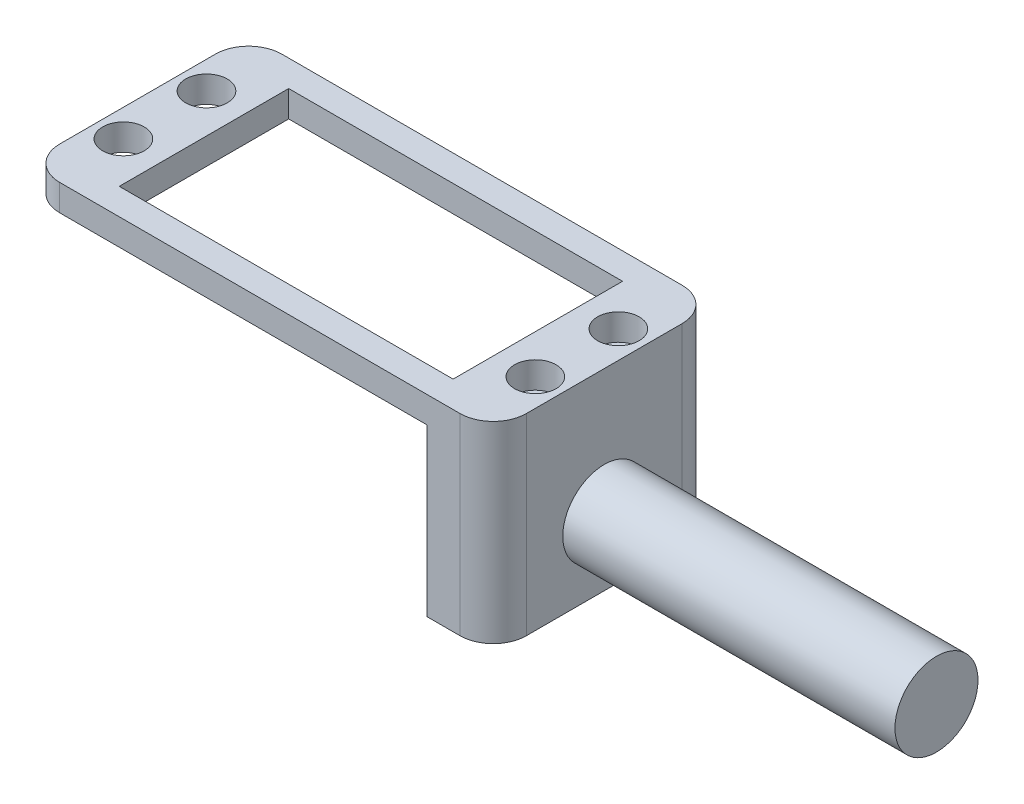
ISO-10303-21;
HEADER;
FILE_DESCRIPTION(('STEP AP214'),'2;1');
FILE_NAME('part.step','',(''),(''),'','','');
FILE_SCHEMA(('AUTOMOTIVE_DESIGN { 1 0 10303 214 1 1 1 1 }'));
ENDSEC;
DATA;
#1=APPLICATION_CONTEXT('core data for automotive mechanical design processes');
#2=APPLICATION_PROTOCOL_DEFINITION('international standard','automotive_design',2000,#1);
#3=PRODUCT_CONTEXT('',#1,'mechanical');
#4=PRODUCT('Part','Part','',(#3));
#5=PRODUCT_RELATED_PRODUCT_CATEGORY('part','',(#4));
#6=PRODUCT_DEFINITION_FORMATION('','',#4);
#7=PRODUCT_DEFINITION_CONTEXT('part definition',#1,'design');
#8=PRODUCT_DEFINITION('design','',#6,#7);
#9=PRODUCT_DEFINITION_SHAPE('','',#8);
#10=(LENGTH_UNIT() NAMED_UNIT(*) SI_UNIT(.MILLI.,.METRE.));
#11=(NAMED_UNIT(*) PLANE_ANGLE_UNIT() SI_UNIT($,.RADIAN.));
#12=(NAMED_UNIT(*) SI_UNIT($,.STERADIAN.) SOLID_ANGLE_UNIT());
#13=UNCERTAINTY_MEASURE_WITH_UNIT(LENGTH_MEASURE(1.E-05),#10,'distance_accuracy_value','');
#14=(GEOMETRIC_REPRESENTATION_CONTEXT(3) GLOBAL_UNCERTAINTY_ASSIGNED_CONTEXT((#13)) GLOBAL_UNIT_ASSIGNED_CONTEXT((#10,
#11,#12)) REPRESENTATION_CONTEXT('',''));
#15=CARTESIAN_POINT('',(0.,0.,0.));
#16=DIRECTION('',(0.,0.,1.));
#17=DIRECTION('',(1.,0.,0.));
#18=AXIS2_PLACEMENT_3D('',#15,#16,#17);
#19=CARTESIAN_POINT('',(0.,0.,0.));
#20=DIRECTION('',(0.,1.,0.));
#21=DIRECTION('',(0.,0.,1.));
#22=AXIS2_PLACEMENT_3D('',#19,#20,#21);
#23=PLANE('',#22);
#24=CARTESIAN_POINT('',(-24.8,0.,-4.99999999999998));
#25=DIRECTION('',(0.,1.,0.));
#26=DIRECTION('',(0.,0.,-1.));
#27=AXIS2_PLACEMENT_3D('',#24,#25,#26);
#28=CIRCLE('',#27,2.5);
#29=CARTESIAN_POINT('',(-24.8,0.,-7.49999999999998));
#30=VERTEX_POINT('',#29);
#31=EDGE_CURVE('E156',#30,#30,#28,.T.);
#32=ORIENTED_EDGE('',*,*,#31,.T.);
#33=EDGE_LOOP('',(#32));
#34=FACE_BOUND('',#33,.T.);
#35=CARTESIAN_POINT('',(-24.8,0.,5.00000000000002));
#36=DIRECTION('',(0.,1.,0.));
#37=DIRECTION('',(0.,0.,-1.));
#38=AXIS2_PLACEMENT_3D('',#35,#36,#37);
#39=CIRCLE('',#38,2.5);
#40=CARTESIAN_POINT('',(-24.8,0.,2.50000000000002));
#41=VERTEX_POINT('',#40);
#42=EDGE_CURVE('E177',#41,#41,#39,.T.);
#43=ORIENTED_EDGE('',*,*,#42,.T.);
#44=EDGE_LOOP('',(#43));
#45=FACE_BOUND('',#44,.T.);
#46=DIRECTION('',(1.,0.,0.));
#47=VECTOR('',#46,1.);
#48=CARTESIAN_POINT('',(-28.1,0.,13.375));
#49=LINE('',#48,#47);
#50=CARTESIAN_POINT('',(-24.1,0.,13.375));
#51=VERTEX_POINT('',#50);
#52=CARTESIAN_POINT('',(20.1,0.,13.375));
#53=VERTEX_POINT('',#52);
#54=EDGE_CURVE('E152',#51,#53,#49,.T.);
#55=ORIENTED_EDGE('',*,*,#54,.F.);
#56=CARTESIAN_POINT('',(-24.1,0.,9.375));
#57=DIRECTION('',(0.,1.,0.));
#58=DIRECTION('',(0.,0.,1.));
#59=AXIS2_PLACEMENT_3D('',#56,#57,#58);
#60=CIRCLE('',#59,4.);
#61=CARTESIAN_POINT('',(-28.1,0.,9.37500000000001));
#62=VERTEX_POINT('',#61);
#63=EDGE_CURVE('E48',#51,#62,#60,.F.);
#64=ORIENTED_EDGE('',*,*,#63,.T.);
#65=DIRECTION('',(0.,0.,1.));
#66=VECTOR('',#65,1.);
#67=CARTESIAN_POINT('',(-28.1,0.,-13.375));
#68=LINE('',#67,#66);
#69=CARTESIAN_POINT('',(-28.1,0.,-9.37499999999999));
#70=VERTEX_POINT('',#69);
#71=EDGE_CURVE('E238',#70,#62,#68,.T.);
#72=ORIENTED_EDGE('',*,*,#71,.F.);
#73=CARTESIAN_POINT('',(-24.1,0.,-9.37499999999999));
#74=DIRECTION('',(0.,1.,0.));
#75=DIRECTION('',(0.,0.,1.));
#76=AXIS2_PLACEMENT_3D('',#73,#74,#75);
#77=CIRCLE('',#76,4.);
#78=CARTESIAN_POINT('',(-24.1,0.,-13.375));
#79=VERTEX_POINT('',#78);
#80=EDGE_CURVE('E56',#70,#79,#77,.F.);
#81=ORIENTED_EDGE('',*,*,#80,.T.);
#82=DIRECTION('',(-1.,0.,0.));
#83=VECTOR('',#82,1.);
#84=CARTESIAN_POINT('',(-28.1,0.,-13.375));
#85=LINE('',#84,#83);
#86=CARTESIAN_POINT('',(20.1,0.,-13.375));
#87=VERTEX_POINT('',#86);
#88=EDGE_CURVE('E223',#87,#79,#85,.T.);
#89=ORIENTED_EDGE('',*,*,#88,.F.);
#90=DIRECTION('',(0.,0.,-1.));
#91=VECTOR('',#90,1.);
#92=CARTESIAN_POINT('',(20.1,0.,-13.375));
#93=LINE('',#92,#91);
#94=CARTESIAN_POINT('',(20.1,0.,-10.2));
#95=VERTEX_POINT('',#94);
#96=EDGE_CURVE('E172',#95,#87,#93,.T.);
#97=ORIENTED_EDGE('',*,*,#96,.F.);
#98=DIRECTION('',(-1.,0.,0.));
#99=VECTOR('',#98,1.);
#100=CARTESIAN_POINT('',(-20.1,0.,-10.2));
#101=LINE('',#100,#99);
#102=CARTESIAN_POINT('',(-20.1,0.,-10.2));
#103=VERTEX_POINT('',#102);
#104=EDGE_CURVE('E195',#95,#103,#101,.T.);
#105=ORIENTED_EDGE('',*,*,#104,.T.);
#106=DIRECTION('',(0.,0.,1.));
#107=VECTOR('',#106,1.);
#108=CARTESIAN_POINT('',(-20.1,0.,-10.2));
#109=LINE('',#108,#107);
#110=CARTESIAN_POINT('',(-20.1,0.,10.2));
#111=VERTEX_POINT('',#110);
#112=EDGE_CURVE('E211',#103,#111,#109,.T.);
#113=ORIENTED_EDGE('',*,*,#112,.T.);
#114=DIRECTION('',(1.,0.,0.));
#115=VECTOR('',#114,1.);
#116=CARTESIAN_POINT('',(-20.1,0.,10.2));
#117=LINE('',#116,#115);
#118=CARTESIAN_POINT('',(20.1,0.,10.2));
#119=VERTEX_POINT('',#118);
#120=EDGE_CURVE('E201',#111,#119,#117,.T.);
#121=ORIENTED_EDGE('',*,*,#120,.T.);
#122=EDGE_CURVE('E169',#53,#119,#93,.T.);
#123=ORIENTED_EDGE('',*,*,#122,.F.);
#124=EDGE_LOOP('',(#55,#64,#72,#81,#89,#97,#105,#113,#121,#123));
#125=FACE_BOUND('',#124,.T.);
#126=ADVANCED_FACE('F33',(#34,#45,#125),#23,.F.);
#127=CARTESIAN_POINT('',(0.,3.175,0.));
#128=DIRECTION('',(0.,1.,0.));
#129=DIRECTION('',(0.,0.,1.));
#130=AXIS2_PLACEMENT_3D('',#127,#128,#129);
#131=PLANE('',#130);
#132=CARTESIAN_POINT('',(-24.8,3.175,5.00000000000002));
#133=DIRECTION('',(0.,1.,0.));
#134=DIRECTION('',(0.,0.,-1.));
#135=AXIS2_PLACEMENT_3D('',#132,#133,#134);
#136=CIRCLE('',#135,2.5);
#137=CARTESIAN_POINT('',(-24.8,3.175,2.50000000000002));
#138=VERTEX_POINT('',#137);
#139=EDGE_CURVE('E180',#138,#138,#136,.T.);
#140=ORIENTED_EDGE('',*,*,#139,.F.);
#141=EDGE_LOOP('',(#140));
#142=FACE_BOUND('',#141,.T.);
#143=CARTESIAN_POINT('',(24.8,3.175,-4.99999999999999));
#144=DIRECTION('',(0.,1.,0.));
#145=DIRECTION('',(0.,0.,1.));
#146=AXIS2_PLACEMENT_3D('',#143,#144,#145);
#147=CIRCLE('',#146,2.5);
#148=CARTESIAN_POINT('',(24.8,3.175,-2.5));
#149=VERTEX_POINT('',#148);
#150=EDGE_CURVE('E192',#149,#149,#147,.T.);
#151=ORIENTED_EDGE('',*,*,#150,.F.);
#152=EDGE_LOOP('',(#151));
#153=FACE_BOUND('',#152,.T.);
#154=DIRECTION('',(0.,0.,-1.));
#155=VECTOR('',#154,1.);
#156=CARTESIAN_POINT('',(28.1,3.175,-13.375));
#157=LINE('',#156,#155);
#158=CARTESIAN_POINT('',(28.1,3.175,9.37499999999999));
#159=VERTEX_POINT('',#158);
#160=CARTESIAN_POINT('',(28.1,3.175,-9.375));
#161=VERTEX_POINT('',#160);
#162=EDGE_CURVE('E224',#159,#161,#157,.T.);
#163=ORIENTED_EDGE('',*,*,#162,.T.);
#164=CARTESIAN_POINT('',(24.1,3.175,-9.375));
#165=DIRECTION('',(0.,1.,0.));
#166=DIRECTION('',(0.,0.,1.));
#167=AXIS2_PLACEMENT_3D('',#164,#165,#166);
#168=CIRCLE('',#167,4.);
#169=CARTESIAN_POINT('',(24.1,3.175,-13.375));
#170=VERTEX_POINT('',#169);
#171=EDGE_CURVE('E260',#161,#170,#168,.T.);
#172=ORIENTED_EDGE('',*,*,#171,.T.);
#173=DIRECTION('',(-1.,0.,0.));
#174=VECTOR('',#173,1.);
#175=CARTESIAN_POINT('',(-28.1,3.175,-13.375));
#176=LINE('',#175,#174);
#177=CARTESIAN_POINT('',(-24.1,3.175,-13.375));
#178=VERTEX_POINT('',#177);
#179=EDGE_CURVE('E227',#170,#178,#176,.T.);
#180=ORIENTED_EDGE('',*,*,#179,.T.);
#181=CARTESIAN_POINT('',(-24.1,3.175,-9.37499999999999));
#182=DIRECTION('',(0.,1.,0.));
#183=DIRECTION('',(0.,0.,1.));
#184=AXIS2_PLACEMENT_3D('',#181,#182,#183);
#185=CIRCLE('',#184,4.);
#186=CARTESIAN_POINT('',(-28.1,3.175,-9.37499999999999));
#187=VERTEX_POINT('',#186);
#188=EDGE_CURVE('E254',#178,#187,#185,.T.);
#189=ORIENTED_EDGE('',*,*,#188,.T.);
#190=DIRECTION('',(0.,0.,1.));
#191=VECTOR('',#190,1.);
#192=CARTESIAN_POINT('',(-28.1,3.175,-13.375));
#193=LINE('',#192,#191);
#194=CARTESIAN_POINT('',(-28.1,3.175,9.37500000000001));
#195=VERTEX_POINT('',#194);
#196=EDGE_CURVE('E230',#187,#195,#193,.T.);
#197=ORIENTED_EDGE('',*,*,#196,.T.);
#198=CARTESIAN_POINT('',(-24.1,3.175,9.375));
#199=DIRECTION('',(0.,1.,0.));
#200=DIRECTION('',(0.,0.,1.));
#201=AXIS2_PLACEMENT_3D('',#198,#199,#200);
#202=CIRCLE('',#201,4.);
#203=CARTESIAN_POINT('',(-24.1,3.175,13.375));
#204=VERTEX_POINT('',#203);
#205=EDGE_CURVE('E256',#195,#204,#202,.T.);
#206=ORIENTED_EDGE('',*,*,#205,.T.);
#207=DIRECTION('',(1.,0.,0.));
#208=VECTOR('',#207,1.);
#209=CARTESIAN_POINT('',(-28.1,3.175,13.375));
#210=LINE('',#209,#208);
#211=CARTESIAN_POINT('',(24.1,3.175,13.375));
#212=VERTEX_POINT('',#211);
#213=EDGE_CURVE('E233',#204,#212,#210,.T.);
#214=ORIENTED_EDGE('',*,*,#213,.T.);
#215=CARTESIAN_POINT('',(24.1,3.175,9.37499999999999));
#216=DIRECTION('',(0.,1.,0.));
#217=DIRECTION('',(0.,0.,1.));
#218=AXIS2_PLACEMENT_3D('',#215,#216,#217);
#219=CIRCLE('',#218,4.);
#220=EDGE_CURVE('E258',#212,#159,#219,.T.);
#221=ORIENTED_EDGE('',*,*,#220,.T.);
#222=EDGE_LOOP('',(#163,#172,#180,#189,#197,#206,#214,#221));
#223=FACE_BOUND('',#222,.T.);
#224=DIRECTION('',(-1.,0.,0.));
#225=VECTOR('',#224,1.);
#226=CARTESIAN_POINT('',(-20.1,3.175,-10.2));
#227=LINE('',#226,#225);
#228=CARTESIAN_POINT('',(20.1,3.175,-10.2));
#229=VERTEX_POINT('',#228);
#230=CARTESIAN_POINT('',(-20.1,3.175,-10.2));
#231=VERTEX_POINT('',#230);
#232=EDGE_CURVE('E200',#229,#231,#227,.T.);
#233=ORIENTED_EDGE('',*,*,#232,.F.);
#234=DIRECTION('',(0.,0.,-1.));
#235=VECTOR('',#234,1.);
#236=CARTESIAN_POINT('',(20.1,3.175,-10.2));
#237=LINE('',#236,#235);
#238=CARTESIAN_POINT('',(20.1,3.175,10.2));
#239=VERTEX_POINT('',#238);
#240=EDGE_CURVE('E198',#239,#229,#237,.T.);
#241=ORIENTED_EDGE('',*,*,#240,.F.);
#242=DIRECTION('',(1.,0.,0.));
#243=VECTOR('',#242,1.);
#244=CARTESIAN_POINT('',(-20.1,3.175,10.2));
#245=LINE('',#244,#243);
#246=CARTESIAN_POINT('',(-20.1,3.175,10.2));
#247=VERTEX_POINT('',#246);
#248=EDGE_CURVE('E206',#247,#239,#245,.T.);
#249=ORIENTED_EDGE('',*,*,#248,.F.);
#250=DIRECTION('',(0.,0.,1.));
#251=VECTOR('',#250,1.);
#252=CARTESIAN_POINT('',(-20.1,3.175,-10.2));
#253=LINE('',#252,#251);
#254=EDGE_CURVE('E203',#231,#247,#253,.T.);
#255=ORIENTED_EDGE('',*,*,#254,.F.);
#256=EDGE_LOOP('',(#233,#241,#249,#255));
#257=FACE_BOUND('',#256,.T.);
#258=CARTESIAN_POINT('',(24.8,3.175,5.00000000000001));
#259=DIRECTION('',(0.,1.,0.));
#260=DIRECTION('',(0.,0.,1.));
#261=AXIS2_PLACEMENT_3D('',#258,#259,#260);
#262=CIRCLE('',#261,2.5);
#263=CARTESIAN_POINT('',(24.8,3.175,7.50000000000001));
#264=VERTEX_POINT('',#263);
#265=EDGE_CURVE('E186',#264,#264,#262,.T.);
#266=ORIENTED_EDGE('',*,*,#265,.F.);
#267=EDGE_LOOP('',(#266));
#268=FACE_BOUND('',#267,.T.);
#269=CARTESIAN_POINT('',(-24.8,3.175,-4.99999999999998));
#270=DIRECTION('',(0.,1.,0.));
#271=DIRECTION('',(0.,0.,-1.));
#272=AXIS2_PLACEMENT_3D('',#269,#270,#271);
#273=CIRCLE('',#272,2.5);
#274=CARTESIAN_POINT('',(-24.8,3.175,-7.49999999999998));
#275=VERTEX_POINT('',#274);
#276=EDGE_CURVE('E174',#275,#275,#273,.T.);
#277=ORIENTED_EDGE('',*,*,#276,.F.);
#278=EDGE_LOOP('',(#277));
#279=FACE_BOUND('',#278,.T.);
#280=ADVANCED_FACE('F276',(#142,#153,#223,#257,#268,#279),#131,.T.);
#281=CARTESIAN_POINT('',(28.1,3.175,-13.375));
#282=DIRECTION('',(-1.,0.,0.));
#283=DIRECTION('',(0.,0.,1.));
#284=AXIS2_PLACEMENT_3D('',#281,#282,#283);
#285=PLANE('',#284);
#286=CARTESIAN_POINT('',(28.1,-11.825,0.));
#287=DIRECTION('',(-1.,0.,0.));
#288=DIRECTION('',(0.,0.,1.));
#289=AXIS2_PLACEMENT_3D('',#286,#287,#288);
#290=CIRCLE('',#289,5.);
#291=CARTESIAN_POINT('',(28.1,-11.825,5.));
#292=VERTEX_POINT('',#291);
#293=EDGE_CURVE('E11',#292,#292,#290,.F.);
#294=ORIENTED_EDGE('',*,*,#293,.F.);
#295=EDGE_LOOP('',(#294));
#296=FACE_BOUND('',#295,.T.);
#297=DIRECTION('',(0.,0.,1.));
#298=VECTOR('',#297,1.);
#299=CARTESIAN_POINT('',(28.1,-20.,-13.375));
#300=LINE('',#299,#298);
#301=CARTESIAN_POINT('',(28.1,-20.,-9.375));
#302=VERTEX_POINT('',#301);
#303=CARTESIAN_POINT('',(28.1,-20.,9.37499999999999));
#304=VERTEX_POINT('',#303);
#305=EDGE_CURVE('E146',#302,#304,#300,.T.);
#306=ORIENTED_EDGE('',*,*,#305,.F.);
#307=DIRECTION('',(0.,-1.,0.));
#308=VECTOR('',#307,1.);
#309=CARTESIAN_POINT('',(28.1,3.175,-9.375));
#310=LINE('',#309,#308);
#311=EDGE_CURVE('E252',#302,#161,#310,.F.);
#312=ORIENTED_EDGE('',*,*,#311,.T.);
#313=ORIENTED_EDGE('',*,*,#162,.F.);
#314=DIRECTION('',(0.,-1.,0.));
#315=VECTOR('',#314,1.);
#316=CARTESIAN_POINT('',(28.1,3.175,9.37499999999999));
#317=LINE('',#316,#315);
#318=EDGE_CURVE('E249',#159,#304,#317,.T.);
#319=ORIENTED_EDGE('',*,*,#318,.T.);
#320=EDGE_LOOP('',(#306,#312,#313,#319));
#321=FACE_BOUND('',#320,.T.);
#322=ADVANCED_FACE('F306',(#296,#321),#285,.F.);
#323=CARTESIAN_POINT('',(-28.1,3.175,-13.375));
#324=DIRECTION('',(0.,0.,1.));
#325=DIRECTION('',(1.,0.,0.));
#326=AXIS2_PLACEMENT_3D('',#323,#324,#325);
#327=PLANE('',#326);
#328=ORIENTED_EDGE('',*,*,#179,.F.);
#329=DIRECTION('',(0.,-1.,0.));
#330=VECTOR('',#329,1.);
#331=CARTESIAN_POINT('',(24.1,3.175,-13.375));
#332=LINE('',#331,#330);
#333=CARTESIAN_POINT('',(24.1,-20.,-13.375));
#334=VERTEX_POINT('',#333);
#335=EDGE_CURVE('E243',#170,#334,#332,.T.);
#336=ORIENTED_EDGE('',*,*,#335,.T.);
#337=DIRECTION('',(1.,0.,0.));
#338=VECTOR('',#337,1.);
#339=CARTESIAN_POINT('',(28.1,-20.,-13.375));
#340=LINE('',#339,#338);
#341=CARTESIAN_POINT('',(20.1,-20.,-13.375));
#342=VERTEX_POINT('',#341);
#343=EDGE_CURVE('E164',#342,#334,#340,.T.);
#344=ORIENTED_EDGE('',*,*,#343,.F.);
#345=DIRECTION('',(0.,1.,0.));
#346=VECTOR('',#345,1.);
#347=CARTESIAN_POINT('',(20.1,-20.,-13.375));
#348=LINE('',#347,#346);
#349=EDGE_CURVE('E157',#342,#87,#348,.T.);
#350=ORIENTED_EDGE('',*,*,#349,.T.);
#351=ORIENTED_EDGE('',*,*,#88,.T.);
#352=DIRECTION('',(0.,-1.,0.));
#353=VECTOR('',#352,1.);
#354=CARTESIAN_POINT('',(-24.1,3.175,-13.375));
#355=LINE('',#354,#353);
#356=EDGE_CURVE('E241',#79,#178,#355,.F.);
#357=ORIENTED_EDGE('',*,*,#356,.T.);
#358=EDGE_LOOP('',(#328,#336,#344,#350,#351,#357));
#359=FACE_BOUND('',#358,.T.);
#360=ADVANCED_FACE('F300',(#359),#327,.F.);
#361=CARTESIAN_POINT('',(-28.1,3.175,-13.375));
#362=DIRECTION('',(1.,0.,0.));
#363=DIRECTION('',(0.,0.,-1.));
#364=AXIS2_PLACEMENT_3D('',#361,#362,#363);
#365=PLANE('',#364);
#366=ORIENTED_EDGE('',*,*,#71,.T.);
#367=DIRECTION('',(0.,-1.,0.));
#368=VECTOR('',#367,1.);
#369=CARTESIAN_POINT('',(-28.1,3.175,9.37500000000001));
#370=LINE('',#369,#368);
#371=EDGE_CURVE('E41',#62,#195,#370,.F.);
#372=ORIENTED_EDGE('',*,*,#371,.T.);
#373=ORIENTED_EDGE('',*,*,#196,.F.);
#374=DIRECTION('',(0.,-1.,0.));
#375=VECTOR('',#374,1.);
#376=CARTESIAN_POINT('',(-28.1,3.175,-9.37499999999999));
#377=LINE('',#376,#375);
#378=EDGE_CURVE('E268',#187,#70,#377,.T.);
#379=ORIENTED_EDGE('',*,*,#378,.T.);
#380=EDGE_LOOP('',(#366,#372,#373,#379));
#381=FACE_BOUND('',#380,.T.);
#382=ADVANCED_FACE('F272',(#381),#365,.F.);
#383=CARTESIAN_POINT('',(-28.1,3.175,13.375));
#384=DIRECTION('',(0.,0.,-1.));
#385=DIRECTION('',(-1.,0.,0.));
#386=AXIS2_PLACEMENT_3D('',#383,#384,#385);
#387=PLANE('',#386);
#388=DIRECTION('',(-1.,0.,0.));
#389=VECTOR('',#388,1.);
#390=CARTESIAN_POINT('',(28.1,-20.,13.375));
#391=LINE('',#390,#389);
#392=CARTESIAN_POINT('',(24.1,-20.,13.375));
#393=VERTEX_POINT('',#392);
#394=CARTESIAN_POINT('',(20.1,-20.,13.375));
#395=VERTEX_POINT('',#394);
#396=EDGE_CURVE('E135',#393,#395,#391,.T.);
#397=ORIENTED_EDGE('',*,*,#396,.F.);
#398=DIRECTION('',(0.,-1.,0.));
#399=VECTOR('',#398,1.);
#400=CARTESIAN_POINT('',(24.1,3.175,13.375));
#401=LINE('',#400,#399);
#402=EDGE_CURVE('E264',#393,#212,#401,.F.);
#403=ORIENTED_EDGE('',*,*,#402,.T.);
#404=ORIENTED_EDGE('',*,*,#213,.F.);
#405=DIRECTION('',(0.,-1.,0.));
#406=VECTOR('',#405,1.);
#407=CARTESIAN_POINT('',(-24.1,3.175,13.375));
#408=LINE('',#407,#406);
#409=EDGE_CURVE('E262',#204,#51,#408,.T.);
#410=ORIENTED_EDGE('',*,*,#409,.T.);
#411=ORIENTED_EDGE('',*,*,#54,.T.);
#412=DIRECTION('',(0.,1.,0.));
#413=VECTOR('',#412,1.);
#414=CARTESIAN_POINT('',(20.1,-20.,13.375));
#415=LINE('',#414,#413);
#416=EDGE_CURVE('E149',#395,#53,#415,.T.);
#417=ORIENTED_EDGE('',*,*,#416,.F.);
#418=EDGE_LOOP('',(#397,#403,#404,#410,#411,#417));
#419=FACE_BOUND('',#418,.T.);
#420=ADVANCED_FACE('F150',(#419),#387,.F.);
#421=CARTESIAN_POINT('',(20.1,3.175,-10.2));
#422=DIRECTION('',(-1.,0.,0.));
#423=DIRECTION('',(0.,0.,1.));
#424=AXIS2_PLACEMENT_3D('',#421,#422,#423);
#425=PLANE('',#424);
#426=DIRECTION('',(0.,-1.,0.));
#427=VECTOR('',#426,1.);
#428=CARTESIAN_POINT('',(20.1,3.175,-10.2));
#429=LINE('',#428,#427);
#430=EDGE_CURVE('E221',#229,#95,#429,.T.);
#431=ORIENTED_EDGE('',*,*,#430,.T.);
#432=ORIENTED_EDGE('',*,*,#96,.T.);
#433=ORIENTED_EDGE('',*,*,#349,.F.);
#434=DIRECTION('',(0.,0.,-1.));
#435=VECTOR('',#434,1.);
#436=CARTESIAN_POINT('',(20.1,-20.,-13.375));
#437=LINE('',#436,#435);
#438=EDGE_CURVE('E140',#395,#342,#437,.T.);
#439=ORIENTED_EDGE('',*,*,#438,.F.);
#440=ORIENTED_EDGE('',*,*,#416,.T.);
#441=ORIENTED_EDGE('',*,*,#122,.T.);
#442=DIRECTION('',(0.,-1.,0.));
#443=VECTOR('',#442,1.);
#444=CARTESIAN_POINT('',(20.1,3.175,10.2));
#445=LINE('',#444,#443);
#446=EDGE_CURVE('E208',#239,#119,#445,.T.);
#447=ORIENTED_EDGE('',*,*,#446,.F.);
#448=ORIENTED_EDGE('',*,*,#240,.T.);
#449=EDGE_LOOP('',(#431,#432,#433,#439,#440,#441,#447,#448));
#450=FACE_BOUND('',#449,.T.);
#451=ADVANCED_FACE('F160',(#450),#425,.T.);
#452=CARTESIAN_POINT('',(-20.1,3.175,-10.2));
#453=DIRECTION('',(0.,0.,1.));
#454=DIRECTION('',(1.,0.,0.));
#455=AXIS2_PLACEMENT_3D('',#452,#453,#454);
#456=PLANE('',#455);
#457=ORIENTED_EDGE('',*,*,#104,.F.);
#458=ORIENTED_EDGE('',*,*,#430,.F.);
#459=ORIENTED_EDGE('',*,*,#232,.T.);
#460=DIRECTION('',(0.,-1.,0.));
#461=VECTOR('',#460,1.);
#462=CARTESIAN_POINT('',(-20.1,3.175,-10.2));
#463=LINE('',#462,#461);
#464=EDGE_CURVE('E219',#231,#103,#463,.T.);
#465=ORIENTED_EDGE('',*,*,#464,.T.);
#466=EDGE_LOOP('',(#457,#458,#459,#465));
#467=FACE_BOUND('',#466,.T.);
#468=ADVANCED_FACE('F294',(#467),#456,.T.);
#469=CARTESIAN_POINT('',(-20.1,3.175,-10.2));
#470=DIRECTION('',(1.,0.,0.));
#471=DIRECTION('',(0.,0.,-1.));
#472=AXIS2_PLACEMENT_3D('',#469,#470,#471);
#473=PLANE('',#472);
#474=ORIENTED_EDGE('',*,*,#112,.F.);
#475=ORIENTED_EDGE('',*,*,#464,.F.);
#476=ORIENTED_EDGE('',*,*,#254,.T.);
#477=DIRECTION('',(0.,-1.,0.));
#478=VECTOR('',#477,1.);
#479=CARTESIAN_POINT('',(-20.1,3.175,10.2));
#480=LINE('',#479,#478);
#481=EDGE_CURVE('E217',#247,#111,#480,.T.);
#482=ORIENTED_EDGE('',*,*,#481,.T.);
#483=EDGE_LOOP('',(#474,#475,#476,#482));
#484=FACE_BOUND('',#483,.T.);
#485=ADVANCED_FACE('F297',(#484),#473,.T.);
#486=CARTESIAN_POINT('',(-20.1,3.175,10.2));
#487=DIRECTION('',(0.,0.,-1.));
#488=DIRECTION('',(-1.,0.,0.));
#489=AXIS2_PLACEMENT_3D('',#486,#487,#488);
#490=PLANE('',#489);
#491=ORIENTED_EDGE('',*,*,#120,.F.);
#492=ORIENTED_EDGE('',*,*,#481,.F.);
#493=ORIENTED_EDGE('',*,*,#248,.T.);
#494=ORIENTED_EDGE('',*,*,#446,.T.);
#495=EDGE_LOOP('',(#491,#492,#493,#494));
#496=FACE_BOUND('',#495,.T.);
#497=ADVANCED_FACE('F410',(#496),#490,.T.);
#498=CARTESIAN_POINT('',(24.8,3.175,-4.99999999999999));
#499=DIRECTION('',(0.,-1.,0.));
#500=DIRECTION('',(0.,0.,-1.));
#501=AXIS2_PLACEMENT_3D('',#498,#499,#500);
#502=CYLINDRICAL_SURFACE('',#501,2.5);
#503=ORIENTED_EDGE('',*,*,#150,.T.);
#504=EDGE_LOOP('',(#503));
#505=FACE_BOUND('',#504,.T.);
#506=CARTESIAN_POINT('',(24.8,0.,-4.99999999999999));
#507=DIRECTION('',(0.,1.,0.));
#508=DIRECTION('',(0.,0.,1.));
#509=AXIS2_PLACEMENT_3D('',#506,#507,#508);
#510=CIRCLE('',#509,2.5);
#511=CARTESIAN_POINT('',(24.8,0.,-2.5));
#512=VERTEX_POINT('',#511);
#513=EDGE_CURVE('E189',#512,#512,#510,.T.);
#514=ORIENTED_EDGE('',*,*,#513,.F.);
#515=EDGE_LOOP('',(#514));
#516=FACE_BOUND('',#515,.T.);
#517=ADVANCED_FACE('F406',(#505,#516),#502,.F.);
#518=CARTESIAN_POINT('',(24.8,3.175,5.00000000000001));
#519=DIRECTION('',(0.,-1.,0.));
#520=DIRECTION('',(0.,0.,-1.));
#521=AXIS2_PLACEMENT_3D('',#518,#519,#520);
#522=CYLINDRICAL_SURFACE('',#521,2.5);
#523=ORIENTED_EDGE('',*,*,#265,.T.);
#524=EDGE_LOOP('',(#523));
#525=FACE_BOUND('',#524,.T.);
#526=CARTESIAN_POINT('',(24.8,0.,5.00000000000001));
#527=DIRECTION('',(0.,1.,0.));
#528=DIRECTION('',(0.,0.,1.));
#529=AXIS2_PLACEMENT_3D('',#526,#527,#528);
#530=CIRCLE('',#529,2.5);
#531=CARTESIAN_POINT('',(24.8,0.,7.50000000000001));
#532=VERTEX_POINT('',#531);
#533=EDGE_CURVE('E183',#532,#532,#530,.T.);
#534=ORIENTED_EDGE('',*,*,#533,.F.);
#535=EDGE_LOOP('',(#534));
#536=FACE_BOUND('',#535,.T.);
#537=ADVANCED_FACE('F402',(#525,#536),#522,.F.);
#538=CARTESIAN_POINT('',(-24.8,3.175,5.00000000000002));
#539=DIRECTION('',(0.,-1.,0.));
#540=DIRECTION('',(0.,0.,-1.));
#541=AXIS2_PLACEMENT_3D('',#538,#539,#540);
#542=CYLINDRICAL_SURFACE('',#541,2.5);
#543=ORIENTED_EDGE('',*,*,#139,.T.);
#544=EDGE_LOOP('',(#543));
#545=FACE_BOUND('',#544,.T.);
#546=ORIENTED_EDGE('',*,*,#42,.F.);
#547=EDGE_LOOP('',(#546));
#548=FACE_BOUND('',#547,.T.);
#549=ADVANCED_FACE('F398',(#545,#548),#542,.F.);
#550=CARTESIAN_POINT('',(-24.8,3.175,-4.99999999999998));
#551=DIRECTION('',(0.,-1.,0.));
#552=DIRECTION('',(0.,0.,-1.));
#553=AXIS2_PLACEMENT_3D('',#550,#551,#552);
#554=CYLINDRICAL_SURFACE('',#553,2.5);
#555=ORIENTED_EDGE('',*,*,#276,.T.);
#556=EDGE_LOOP('',(#555));
#557=FACE_BOUND('',#556,.T.);
#558=ORIENTED_EDGE('',*,*,#31,.F.);
#559=EDGE_LOOP('',(#558));
#560=FACE_BOUND('',#559,.T.);
#561=ADVANCED_FACE('F393',(#557,#560),#554,.F.);
#562=CARTESIAN_POINT('',(0.,-20.,0.));
#563=DIRECTION('',(0.,-1.,0.));
#564=DIRECTION('',(0.,0.,-1.));
#565=AXIS2_PLACEMENT_3D('',#562,#563,#564);
#566=PLANE('',#565);
#567=ORIENTED_EDGE('',*,*,#343,.T.);
#568=CARTESIAN_POINT('',(24.1,-20.,-9.375));
#569=DIRECTION('',(0.,-1.,0.));
#570=DIRECTION('',(0.,0.,-1.));
#571=AXIS2_PLACEMENT_3D('',#568,#569,#570);
#572=CIRCLE('',#571,4.);
#573=EDGE_CURVE('E247',#334,#302,#572,.T.);
#574=ORIENTED_EDGE('',*,*,#573,.T.);
#575=ORIENTED_EDGE('',*,*,#305,.T.);
#576=CARTESIAN_POINT('',(24.1,-20.,9.37499999999999));
#577=DIRECTION('',(0.,-1.,0.));
#578=DIRECTION('',(0.,0.,-1.));
#579=AXIS2_PLACEMENT_3D('',#576,#577,#578);
#580=CIRCLE('',#579,4.);
#581=EDGE_CURVE('E143',#304,#393,#580,.T.);
#582=ORIENTED_EDGE('',*,*,#581,.T.);
#583=ORIENTED_EDGE('',*,*,#396,.T.);
#584=ORIENTED_EDGE('',*,*,#438,.T.);
#585=EDGE_LOOP('',(#567,#574,#575,#582,#583,#584));
#586=FACE_BOUND('',#585,.T.);
#587=ADVANCED_FACE('F138',(#586),#566,.T.);
#588=CARTESIAN_POINT('',(0.,0.,0.));
#589=DIRECTION('',(0.,-1.,0.));
#590=DIRECTION('',(0.,0.,-1.));
#591=AXIS2_PLACEMENT_3D('',#588,#589,#590);
#592=PLANE('',#591);
#593=ORIENTED_EDGE('',*,*,#533,.T.);
#594=EDGE_LOOP('',(#593));
#595=FACE_BOUND('',#594,.T.);
#596=ADVANCED_FACE('F392',(#595),#592,.F.);
#597=ORIENTED_EDGE('',*,*,#513,.T.);
#598=EDGE_LOOP('',(#597));
#599=FACE_BOUND('',#598,.T.);
#600=ADVANCED_FACE('F343',(#599),#592,.F.);
#601=CARTESIAN_POINT('',(24.1,3.175,-9.375));
#602=DIRECTION('',(0.,-1.,0.));
#603=DIRECTION('',(0.,0.,-1.));
#604=AXIS2_PLACEMENT_3D('',#601,#602,#603);
#605=CYLINDRICAL_SURFACE('',#604,4.);
#606=ORIENTED_EDGE('',*,*,#171,.F.);
#607=ORIENTED_EDGE('',*,*,#311,.F.);
#608=ORIENTED_EDGE('',*,*,#573,.F.);
#609=ORIENTED_EDGE('',*,*,#335,.F.);
#610=EDGE_LOOP('',(#606,#607,#608,#609));
#611=FACE_BOUND('',#610,.T.);
#612=ADVANCED_FACE('F310',(#611),#605,.T.);
#613=CARTESIAN_POINT('',(24.1,3.175,9.37499999999999));
#614=DIRECTION('',(0.,-1.,0.));
#615=DIRECTION('',(0.,0.,-1.));
#616=AXIS2_PLACEMENT_3D('',#613,#614,#615);
#617=CYLINDRICAL_SURFACE('',#616,4.);
#618=ORIENTED_EDGE('',*,*,#220,.F.);
#619=ORIENTED_EDGE('',*,*,#402,.F.);
#620=ORIENTED_EDGE('',*,*,#581,.F.);
#621=ORIENTED_EDGE('',*,*,#318,.F.);
#622=EDGE_LOOP('',(#618,#619,#620,#621));
#623=FACE_BOUND('',#622,.T.);
#624=ADVANCED_FACE('F320',(#623),#617,.T.);
#625=CARTESIAN_POINT('',(-24.1,3.175,9.375));
#626=DIRECTION('',(0.,-1.,0.));
#627=DIRECTION('',(0.,0.,-1.));
#628=AXIS2_PLACEMENT_3D('',#625,#626,#627);
#629=CYLINDRICAL_SURFACE('',#628,4.);
#630=ORIENTED_EDGE('',*,*,#205,.F.);
#631=ORIENTED_EDGE('',*,*,#371,.F.);
#632=ORIENTED_EDGE('',*,*,#63,.F.);
#633=ORIENTED_EDGE('',*,*,#409,.F.);
#634=EDGE_LOOP('',(#630,#631,#632,#633));
#635=FACE_BOUND('',#634,.T.);
#636=ADVANCED_FACE('F281',(#635),#629,.T.);
#637=CARTESIAN_POINT('',(-24.1,3.175,-9.37499999999999));
#638=DIRECTION('',(0.,-1.,0.));
#639=DIRECTION('',(0.,0.,-1.));
#640=AXIS2_PLACEMENT_3D('',#637,#638,#639);
#641=CYLINDRICAL_SURFACE('',#640,4.);
#642=ORIENTED_EDGE('',*,*,#188,.F.);
#643=ORIENTED_EDGE('',*,*,#356,.F.);
#644=ORIENTED_EDGE('',*,*,#80,.F.);
#645=ORIENTED_EDGE('',*,*,#378,.F.);
#646=EDGE_LOOP('',(#642,#643,#644,#645));
#647=FACE_BOUND('',#646,.T.);
#648=ADVANCED_FACE('F35',(#647),#641,.T.);
#649=CARTESIAN_POINT('',(68.1,-11.825,0.));
#650=DIRECTION('',(-1.,0.,0.));
#651=DIRECTION('',(0.,0.,1.));
#652=AXIS2_PLACEMENT_3D('',#649,#650,#651);
#653=CYLINDRICAL_SURFACE('',#652,5.);
#654=CARTESIAN_POINT('',(68.1,-11.825,0.));
#655=DIRECTION('',(1.,0.,0.));
#656=DIRECTION('',(0.,0.,-1.));
#657=AXIS2_PLACEMENT_3D('',#654,#655,#656);
#658=CIRCLE('',#657,5.);
#659=CARTESIAN_POINT('',(68.1,-11.825,-5.));
#660=VERTEX_POINT('',#659);
#661=EDGE_CURVE('E171',#660,#660,#658,.T.);
#662=ORIENTED_EDGE('',*,*,#661,.F.);
#663=EDGE_LOOP('',(#662));
#664=FACE_BOUND('',#663,.T.);
#665=ORIENTED_EDGE('',*,*,#293,.T.);
#666=EDGE_LOOP('',(#665));
#667=FACE_BOUND('',#666,.T.);
#668=ADVANCED_FACE('F312',(#664,#667),#653,.T.);
#669=CARTESIAN_POINT('',(68.1,-11.825,0.));
#670=DIRECTION('',(1.,0.,0.));
#671=DIRECTION('',(0.,0.,-1.));
#672=AXIS2_PLACEMENT_3D('',#669,#670,#671);
#673=PLANE('',#672);
#674=ORIENTED_EDGE('',*,*,#661,.T.);
#675=EDGE_LOOP('',(#674));
#676=FACE_BOUND('',#675,.T.);
#677=ADVANCED_FACE('F317',(#676),#673,.T.);
#678=CLOSED_SHELL('',(#126,#280,#322,#360,#382,#420,#451,#468,#485,#497,#517,#537,#549,#561,
#587,#596,#600,#612,#624,#636,#648,#668,#677));
#679=MANIFOLD_SOLID_BREP('B2',#678);
#680=ADVANCED_BREP_SHAPE_REPRESENTATION('',(#18,#679),#14);
#681=SHAPE_DEFINITION_REPRESENTATION(#9,#680);
ENDSEC;
END-ISO-10303-21;
